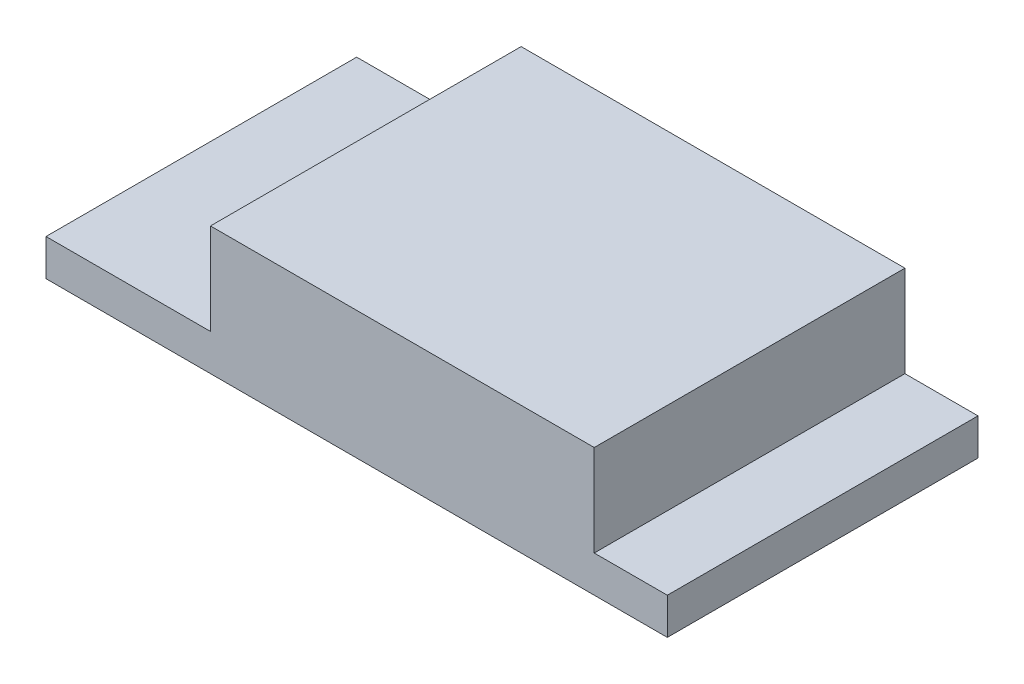
ISO-10303-21;
HEADER;
FILE_DESCRIPTION(('STEP AP214'),'2;1');
FILE_NAME('part.step','',(''),(''),'','','');
FILE_SCHEMA(('AUTOMOTIVE_DESIGN { 1 0 10303 214 1 1 1 1 }'));
ENDSEC;
DATA;
#1=APPLICATION_CONTEXT('core data for automotive mechanical design processes');
#2=APPLICATION_PROTOCOL_DEFINITION('international standard','automotive_design',2000,#1);
#3=PRODUCT_CONTEXT('',#1,'mechanical');
#4=PRODUCT('Part','Part','',(#3));
#5=PRODUCT_RELATED_PRODUCT_CATEGORY('part','',(#4));
#6=PRODUCT_DEFINITION_FORMATION('','',#4);
#7=PRODUCT_DEFINITION_CONTEXT('part definition',#1,'design');
#8=PRODUCT_DEFINITION('design','',#6,#7);
#9=PRODUCT_DEFINITION_SHAPE('','',#8);
#10=(LENGTH_UNIT() NAMED_UNIT(*) SI_UNIT(.MILLI.,.METRE.));
#11=(NAMED_UNIT(*) PLANE_ANGLE_UNIT() SI_UNIT($,.RADIAN.));
#12=(NAMED_UNIT(*) SI_UNIT($,.STERADIAN.) SOLID_ANGLE_UNIT());
#13=UNCERTAINTY_MEASURE_WITH_UNIT(LENGTH_MEASURE(1.E-05),#10,'distance_accuracy_value','');
#14=(GEOMETRIC_REPRESENTATION_CONTEXT(3) GLOBAL_UNCERTAINTY_ASSIGNED_CONTEXT((#13)) GLOBAL_UNIT_ASSIGNED_CONTEXT((#10,
#11,#12)) REPRESENTATION_CONTEXT('',''));
#15=CARTESIAN_POINT('',(0.,0.,0.));
#16=DIRECTION('',(0.,0.,1.));
#17=DIRECTION('',(1.,0.,0.));
#18=AXIS2_PLACEMENT_3D('',#15,#16,#17);
#19=CARTESIAN_POINT('',(0.,2.,0.));
#20=DIRECTION('',(0.,1.,0.));
#21=DIRECTION('',(0.,0.,1.));
#22=AXIS2_PLACEMENT_3D('',#19,#20,#21);
#23=PLANE('',#22);
#24=DIRECTION('',(0.,0.,1.));
#25=VECTOR('',#24,1.);
#26=CARTESIAN_POINT('',(-7.99999999999999,2.,-8.5));
#27=LINE('',#26,#25);
#28=CARTESIAN_POINT('',(-7.99999999999999,2.,-8.5));
#29=VERTEX_POINT('',#28);
#30=CARTESIAN_POINT('',(-7.99999999999999,2.,8.5));
#31=VERTEX_POINT('',#30);
#32=EDGE_CURVE('E51',#29,#31,#27,.T.);
#33=ORIENTED_EDGE('',*,*,#32,.F.);
#34=DIRECTION('',(-1.,0.,0.));
#35=VECTOR('',#34,1.);
#36=CARTESIAN_POINT('',(17.,2.,-8.5));
#37=LINE('',#36,#35);
#38=CARTESIAN_POINT('',(-17.,2.,-8.5));
#39=VERTEX_POINT('',#38);
#40=EDGE_CURVE('E147',#29,#39,#37,.T.);
#41=ORIENTED_EDGE('',*,*,#40,.T.);
#42=DIRECTION('',(0.,0.,1.));
#43=VECTOR('',#42,1.);
#44=CARTESIAN_POINT('',(-17.,2.,8.5));
#45=LINE('',#44,#43);
#46=CARTESIAN_POINT('',(-17.,2.,8.5));
#47=VERTEX_POINT('',#46);
#48=EDGE_CURVE('E142',#39,#47,#45,.T.);
#49=ORIENTED_EDGE('',*,*,#48,.T.);
#50=DIRECTION('',(1.,0.,0.));
#51=VECTOR('',#50,1.);
#52=CARTESIAN_POINT('',(17.,2.,8.5));
#53=LINE('',#52,#51);
#54=EDGE_CURVE('E166',#47,#31,#53,.T.);
#55=ORIENTED_EDGE('',*,*,#54,.T.);
#56=EDGE_LOOP('',(#33,#41,#49,#55));
#57=FACE_BOUND('',#56,.T.);
#58=ADVANCED_FACE('F34',(#57),#23,.T.);
#59=CARTESIAN_POINT('',(-17.,2.,8.5));
#60=DIRECTION('',(1.,0.,0.));
#61=DIRECTION('',(0.,0.,-1.));
#62=AXIS2_PLACEMENT_3D('',#59,#60,#61);
#63=PLANE('',#62);
#64=DIRECTION('',(0.,0.,1.));
#65=VECTOR('',#64,1.);
#66=CARTESIAN_POINT('',(-17.,0.,8.5));
#67=LINE('',#66,#65);
#68=CARTESIAN_POINT('',(-17.,0.,-8.5));
#69=VERTEX_POINT('',#68);
#70=CARTESIAN_POINT('',(-17.,0.,8.5));
#71=VERTEX_POINT('',#70);
#72=EDGE_CURVE('E122',#69,#71,#67,.T.);
#73=ORIENTED_EDGE('',*,*,#72,.T.);
#74=DIRECTION('',(0.,-1.,0.));
#75=VECTOR('',#74,1.);
#76=CARTESIAN_POINT('',(-17.,2.,8.5));
#77=LINE('',#76,#75);
#78=EDGE_CURVE('E11',#47,#71,#77,.T.);
#79=ORIENTED_EDGE('',*,*,#78,.F.);
#80=ORIENTED_EDGE('',*,*,#48,.F.);
#81=DIRECTION('',(0.,-1.,0.));
#82=VECTOR('',#81,1.);
#83=CARTESIAN_POINT('',(-17.,2.,-8.5));
#84=LINE('',#83,#82);
#85=EDGE_CURVE('E161',#39,#69,#84,.T.);
#86=ORIENTED_EDGE('',*,*,#85,.T.);
#87=EDGE_LOOP('',(#73,#79,#80,#86));
#88=FACE_BOUND('',#87,.T.);
#89=ADVANCED_FACE('F36',(#88),#63,.F.);
#90=CARTESIAN_POINT('',(17.,2.,8.5));
#91=DIRECTION('',(0.,0.,-1.));
#92=DIRECTION('',(-1.,0.,0.));
#93=AXIS2_PLACEMENT_3D('',#90,#91,#92);
#94=PLANE('',#93);
#95=DIRECTION('',(1.,0.,0.));
#96=VECTOR('',#95,1.);
#97=CARTESIAN_POINT('',(17.,0.,8.5));
#98=LINE('',#97,#96);
#99=CARTESIAN_POINT('',(17.,0.,8.5));
#100=VERTEX_POINT('',#99);
#101=EDGE_CURVE('E125',#71,#100,#98,.T.);
#102=ORIENTED_EDGE('',*,*,#101,.T.);
#103=DIRECTION('',(0.,-1.,0.));
#104=VECTOR('',#103,1.);
#105=CARTESIAN_POINT('',(17.,2.,8.5));
#106=LINE('',#105,#104);
#107=CARTESIAN_POINT('',(17.,2.,8.5));
#108=VERTEX_POINT('',#107);
#109=EDGE_CURVE('E43',#108,#100,#106,.T.);
#110=ORIENTED_EDGE('',*,*,#109,.F.);
#111=CARTESIAN_POINT('',(13.,2.,8.5));
#112=VERTEX_POINT('',#111);
#113=EDGE_CURVE('E170',#112,#108,#53,.T.);
#114=ORIENTED_EDGE('',*,*,#113,.F.);
#115=DIRECTION('',(0.,-1.,0.));
#116=VECTOR('',#115,1.);
#117=CARTESIAN_POINT('',(13.,7.,8.5));
#118=LINE('',#117,#116);
#119=CARTESIAN_POINT('',(13.,7.,8.5));
#120=VERTEX_POINT('',#119);
#121=EDGE_CURVE('E107',#120,#112,#118,.T.);
#122=ORIENTED_EDGE('',*,*,#121,.F.);
#123=DIRECTION('',(1.,0.,0.));
#124=VECTOR('',#123,1.);
#125=CARTESIAN_POINT('',(-7.99999999999999,7.,8.5));
#126=LINE('',#125,#124);
#127=CARTESIAN_POINT('',(-7.99999999999999,7.,8.5));
#128=VERTEX_POINT('',#127);
#129=EDGE_CURVE('E101',#128,#120,#126,.T.);
#130=ORIENTED_EDGE('',*,*,#129,.F.);
#131=DIRECTION('',(0.,-1.,0.));
#132=VECTOR('',#131,1.);
#133=CARTESIAN_POINT('',(-7.99999999999999,7.,8.5));
#134=LINE('',#133,#132);
#135=EDGE_CURVE('E105',#128,#31,#134,.T.);
#136=ORIENTED_EDGE('',*,*,#135,.T.);
#137=ORIENTED_EDGE('',*,*,#54,.F.);
#138=ORIENTED_EDGE('',*,*,#78,.T.);
#139=EDGE_LOOP('',(#102,#110,#114,#122,#130,#136,#137,#138));
#140=FACE_BOUND('',#139,.T.);
#141=ADVANCED_FACE('F103',(#140),#94,.F.);
#142=CARTESIAN_POINT('',(17.,2.,8.5));
#143=DIRECTION('',(-1.,0.,0.));
#144=DIRECTION('',(0.,0.,1.));
#145=AXIS2_PLACEMENT_3D('',#142,#143,#144);
#146=PLANE('',#145);
#147=DIRECTION('',(0.,0.,-1.));
#148=VECTOR('',#147,1.);
#149=CARTESIAN_POINT('',(17.,0.,8.5));
#150=LINE('',#149,#148);
#151=CARTESIAN_POINT('',(17.,0.,-8.5));
#152=VERTEX_POINT('',#151);
#153=EDGE_CURVE('E186',#100,#152,#150,.T.);
#154=ORIENTED_EDGE('',*,*,#153,.T.);
#155=DIRECTION('',(0.,-1.,0.));
#156=VECTOR('',#155,1.);
#157=CARTESIAN_POINT('',(17.,2.,-8.5));
#158=LINE('',#157,#156);
#159=CARTESIAN_POINT('',(17.,2.,-8.5));
#160=VERTEX_POINT('',#159);
#161=EDGE_CURVE('E180',#160,#152,#158,.T.);
#162=ORIENTED_EDGE('',*,*,#161,.F.);
#163=DIRECTION('',(0.,0.,-1.));
#164=VECTOR('',#163,1.);
#165=CARTESIAN_POINT('',(17.,2.,8.5));
#166=LINE('',#165,#164);
#167=EDGE_CURVE('E165',#108,#160,#166,.T.);
#168=ORIENTED_EDGE('',*,*,#167,.F.);
#169=ORIENTED_EDGE('',*,*,#109,.T.);
#170=EDGE_LOOP('',(#154,#162,#168,#169));
#171=FACE_BOUND('',#170,.T.);
#172=ADVANCED_FACE('F193',(#171),#146,.F.);
#173=CARTESIAN_POINT('',(17.,2.,-8.5));
#174=DIRECTION('',(0.,0.,1.));
#175=DIRECTION('',(1.,0.,0.));
#176=AXIS2_PLACEMENT_3D('',#173,#174,#175);
#177=PLANE('',#176);
#178=DIRECTION('',(-1.,0.,0.));
#179=VECTOR('',#178,1.);
#180=CARTESIAN_POINT('',(17.,0.,-8.5));
#181=LINE('',#180,#179);
#182=EDGE_CURVE('E184',#152,#69,#181,.T.);
#183=ORIENTED_EDGE('',*,*,#182,.T.);
#184=ORIENTED_EDGE('',*,*,#85,.F.);
#185=ORIENTED_EDGE('',*,*,#40,.F.);
#186=DIRECTION('',(0.,-1.,0.));
#187=VECTOR('',#186,1.);
#188=CARTESIAN_POINT('',(-7.99999999999999,7.,-8.5));
#189=LINE('',#188,#187);
#190=CARTESIAN_POINT('',(-7.99999999999999,7.,-8.5));
#191=VERTEX_POINT('',#190);
#192=EDGE_CURVE('E135',#191,#29,#189,.T.);
#193=ORIENTED_EDGE('',*,*,#192,.F.);
#194=DIRECTION('',(-1.,0.,0.));
#195=VECTOR('',#194,1.);
#196=CARTESIAN_POINT('',(-7.99999999999999,7.,-8.5));
#197=LINE('',#196,#195);
#198=CARTESIAN_POINT('',(13.,7.,-8.5));
#199=VERTEX_POINT('',#198);
#200=EDGE_CURVE('E116',#199,#191,#197,.T.);
#201=ORIENTED_EDGE('',*,*,#200,.F.);
#202=DIRECTION('',(0.,-1.,0.));
#203=VECTOR('',#202,1.);
#204=CARTESIAN_POINT('',(13.,7.,-8.5));
#205=LINE('',#204,#203);
#206=CARTESIAN_POINT('',(13.,2.,-8.5));
#207=VERTEX_POINT('',#206);
#208=EDGE_CURVE('E127',#199,#207,#205,.T.);
#209=ORIENTED_EDGE('',*,*,#208,.T.);
#210=EDGE_CURVE('E164',#160,#207,#37,.T.);
#211=ORIENTED_EDGE('',*,*,#210,.F.);
#212=ORIENTED_EDGE('',*,*,#161,.T.);
#213=EDGE_LOOP('',(#183,#184,#185,#193,#201,#209,#211,#212));
#214=FACE_BOUND('',#213,.T.);
#215=ADVANCED_FACE('F158',(#214),#177,.F.);
#216=DIRECTION('',(0.,0.,-1.));
#217=VECTOR('',#216,1.);
#218=CARTESIAN_POINT('',(13.,2.,-8.5));
#219=LINE('',#218,#217);
#220=EDGE_CURVE('E59',#112,#207,#219,.T.);
#221=ORIENTED_EDGE('',*,*,#220,.F.);
#222=ORIENTED_EDGE('',*,*,#113,.T.);
#223=ORIENTED_EDGE('',*,*,#167,.T.);
#224=ORIENTED_EDGE('',*,*,#210,.T.);
#225=EDGE_LOOP('',(#221,#222,#223,#224));
#226=FACE_BOUND('',#225,.T.);
#227=ADVANCED_FACE('F199',(#226),#23,.T.);
#228=CARTESIAN_POINT('',(0.,0.,0.));
#229=DIRECTION('',(0.,1.,0.));
#230=DIRECTION('',(0.,0.,1.));
#231=AXIS2_PLACEMENT_3D('',#228,#229,#230);
#232=PLANE('',#231);
#233=ORIENTED_EDGE('',*,*,#72,.F.);
#234=ORIENTED_EDGE('',*,*,#182,.F.);
#235=ORIENTED_EDGE('',*,*,#153,.F.);
#236=ORIENTED_EDGE('',*,*,#101,.F.);
#237=EDGE_LOOP('',(#233,#234,#235,#236));
#238=FACE_BOUND('',#237,.T.);
#239=ADVANCED_FACE('F195',(#238),#232,.F.);
#240=CARTESIAN_POINT('',(-7.99999999999999,7.,-8.5));
#241=DIRECTION('',(1.,0.,0.));
#242=DIRECTION('',(0.,0.,-1.));
#243=AXIS2_PLACEMENT_3D('',#240,#241,#242);
#244=PLANE('',#243);
#245=ORIENTED_EDGE('',*,*,#32,.T.);
#246=ORIENTED_EDGE('',*,*,#135,.F.);
#247=DIRECTION('',(0.,0.,1.));
#248=VECTOR('',#247,1.);
#249=CARTESIAN_POINT('',(-7.99999999999999,7.,-8.5));
#250=LINE('',#249,#248);
#251=EDGE_CURVE('E111',#191,#128,#250,.T.);
#252=ORIENTED_EDGE('',*,*,#251,.F.);
#253=ORIENTED_EDGE('',*,*,#192,.T.);
#254=EDGE_LOOP('',(#245,#246,#252,#253));
#255=FACE_BOUND('',#254,.T.);
#256=ADVANCED_FACE('F121',(#255),#244,.F.);
#257=CARTESIAN_POINT('',(13.,7.,-8.5));
#258=DIRECTION('',(-1.,0.,0.));
#259=DIRECTION('',(0.,0.,1.));
#260=AXIS2_PLACEMENT_3D('',#257,#258,#259);
#261=PLANE('',#260);
#262=ORIENTED_EDGE('',*,*,#220,.T.);
#263=ORIENTED_EDGE('',*,*,#208,.F.);
#264=DIRECTION('',(0.,0.,-1.));
#265=VECTOR('',#264,1.);
#266=CARTESIAN_POINT('',(13.,7.,-8.5));
#267=LINE('',#266,#265);
#268=EDGE_CURVE('E110',#120,#199,#267,.T.);
#269=ORIENTED_EDGE('',*,*,#268,.F.);
#270=ORIENTED_EDGE('',*,*,#121,.T.);
#271=EDGE_LOOP('',(#262,#263,#269,#270));
#272=FACE_BOUND('',#271,.T.);
#273=ADVANCED_FACE('F157',(#272),#261,.F.);
#274=CARTESIAN_POINT('',(0.,7.,0.));
#275=DIRECTION('',(0.,1.,0.));
#276=DIRECTION('',(0.,0.,1.));
#277=AXIS2_PLACEMENT_3D('',#274,#275,#276);
#278=PLANE('',#277);
#279=ORIENTED_EDGE('',*,*,#251,.T.);
#280=ORIENTED_EDGE('',*,*,#129,.T.);
#281=ORIENTED_EDGE('',*,*,#268,.T.);
#282=ORIENTED_EDGE('',*,*,#200,.T.);
#283=EDGE_LOOP('',(#279,#280,#281,#282));
#284=FACE_BOUND('',#283,.T.);
#285=ADVANCED_FACE('F114',(#284),#278,.T.);
#286=CLOSED_SHELL('',(#58,#89,#141,#172,#215,#227,#239,#256,#273,#285));
#287=MANIFOLD_SOLID_BREP('B2',#286);
#288=ADVANCED_BREP_SHAPE_REPRESENTATION('',(#18,#287),#14);
#289=SHAPE_DEFINITION_REPRESENTATION(#9,#288);
ENDSEC;
END-ISO-10303-21;
